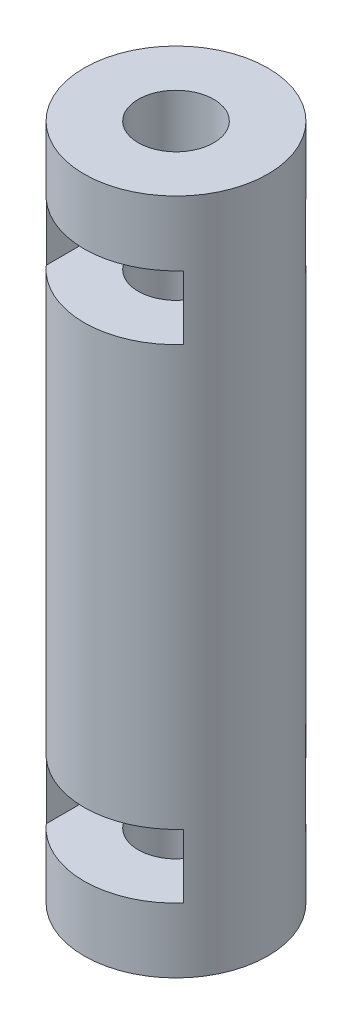
ISO-10303-21;
HEADER;
FILE_DESCRIPTION(('STEP AP214'),'2;1');
FILE_NAME('part.step','',(''),(''),'','','');
FILE_SCHEMA(('AUTOMOTIVE_DESIGN { 1 0 10303 214 1 1 1 1 }'));
ENDSEC;
DATA;
#1=APPLICATION_CONTEXT('core data for automotive mechanical design processes');
#2=APPLICATION_PROTOCOL_DEFINITION('international standard','automotive_design',2000,#1);
#3=PRODUCT_CONTEXT('',#1,'mechanical');
#4=PRODUCT('Part','Part','',(#3));
#5=PRODUCT_RELATED_PRODUCT_CATEGORY('part','',(#4));
#6=PRODUCT_DEFINITION_FORMATION('','',#4);
#7=PRODUCT_DEFINITION_CONTEXT('part definition',#1,'design');
#8=PRODUCT_DEFINITION('design','',#6,#7);
#9=PRODUCT_DEFINITION_SHAPE('','',#8);
#10=(LENGTH_UNIT() NAMED_UNIT(*) SI_UNIT(.MILLI.,.METRE.));
#11=(NAMED_UNIT(*) PLANE_ANGLE_UNIT() SI_UNIT($,.RADIAN.));
#12=(NAMED_UNIT(*) SI_UNIT($,.STERADIAN.) SOLID_ANGLE_UNIT());
#13=UNCERTAINTY_MEASURE_WITH_UNIT(LENGTH_MEASURE(1.E-05),#10,'distance_accuracy_value','');
#14=(GEOMETRIC_REPRESENTATION_CONTEXT(3) GLOBAL_UNCERTAINTY_ASSIGNED_CONTEXT((#13)) GLOBAL_UNIT_ASSIGNED_CONTEXT((#10,
#11,#12)) REPRESENTATION_CONTEXT('',''));
#15=CARTESIAN_POINT('',(0.,0.,0.));
#16=DIRECTION('',(0.,0.,1.));
#17=DIRECTION('',(1.,0.,0.));
#18=AXIS2_PLACEMENT_3D('',#15,#16,#17);
#19=CARTESIAN_POINT('',(0.,35.,0.));
#20=DIRECTION('',(0.,-1.,0.));
#21=DIRECTION('',(0.,0.,-1.));
#22=AXIS2_PLACEMENT_3D('',#19,#20,#21);
#23=CYLINDRICAL_SURFACE('',#22,1.95);
#24=CARTESIAN_POINT('',(0.,31.65,0.));
#25=DIRECTION('',(0.,1.,0.));
#26=DIRECTION('',(0.,0.,1.));
#27=AXIS2_PLACEMENT_3D('',#24,#25,#26);
#28=CIRCLE('',#27,1.95);
#29=CARTESIAN_POINT('',(0.,31.65,1.95));
#30=VERTEX_POINT('',#29);
#31=EDGE_CURVE('E143',#30,#30,#28,.T.);
#32=ORIENTED_EDGE('',*,*,#31,.F.);
#33=EDGE_LOOP('',(#32));
#34=FACE_BOUND('',#33,.T.);
#35=CARTESIAN_POINT('',(0.,35.,0.));
#36=DIRECTION('',(0.,1.,0.));
#37=DIRECTION('',(0.,0.,1.));
#38=AXIS2_PLACEMENT_3D('',#35,#36,#37);
#39=CIRCLE('',#38,1.95);
#40=CARTESIAN_POINT('',(0.,35.,1.95));
#41=VERTEX_POINT('',#40);
#42=EDGE_CURVE('E148',#41,#41,#39,.T.);
#43=ORIENTED_EDGE('',*,*,#42,.T.);
#44=EDGE_LOOP('',(#43));
#45=FACE_BOUND('',#44,.T.);
#46=ADVANCED_FACE('F39',(#34,#45),#23,.F.);
#47=CARTESIAN_POINT('',(0.,35.,0.));
#48=DIRECTION('',(0.,1.,0.));
#49=DIRECTION('',(0.,0.,1.));
#50=AXIS2_PLACEMENT_3D('',#47,#48,#49);
#51=PLANE('',#50);
#52=CARTESIAN_POINT('',(0.,35.,0.));
#53=DIRECTION('',(0.,1.,0.));
#54=DIRECTION('',(0.,0.,1.));
#55=AXIS2_PLACEMENT_3D('',#52,#53,#54);
#56=CIRCLE('',#55,4.75);
#57=CARTESIAN_POINT('',(0.,35.,4.75));
#58=VERTEX_POINT('',#57);
#59=EDGE_CURVE('E153',#58,#58,#56,.T.);
#60=ORIENTED_EDGE('',*,*,#59,.T.);
#61=EDGE_LOOP('',(#60));
#62=FACE_BOUND('',#61,.T.);
#63=ORIENTED_EDGE('',*,*,#42,.F.);
#64=EDGE_LOOP('',(#63));
#65=FACE_BOUND('',#64,.T.);
#66=ADVANCED_FACE('F209',(#62,#65),#51,.T.);
#67=CARTESIAN_POINT('',(0.,0.,0.));
#68=DIRECTION('',(0.,1.,0.));
#69=DIRECTION('',(0.,0.,1.));
#70=AXIS2_PLACEMENT_3D('',#67,#68,#69);
#71=PLANE('',#70);
#72=CARTESIAN_POINT('',(0.,0.,0.));
#73=DIRECTION('',(0.,1.,0.));
#74=DIRECTION('',(0.,0.,1.));
#75=AXIS2_PLACEMENT_3D('',#72,#73,#74);
#76=CIRCLE('',#75,4.75);
#77=CARTESIAN_POINT('',(0.,0.,4.75));
#78=VERTEX_POINT('',#77);
#79=EDGE_CURVE('E149',#78,#78,#76,.T.);
#80=ORIENTED_EDGE('',*,*,#79,.F.);
#81=EDGE_LOOP('',(#80));
#82=FACE_BOUND('',#81,.T.);
#83=CARTESIAN_POINT('',(0.,0.,0.));
#84=DIRECTION('',(0.,1.,0.));
#85=DIRECTION('',(0.,0.,1.));
#86=AXIS2_PLACEMENT_3D('',#83,#84,#85);
#87=CIRCLE('',#86,1.95);
#88=CARTESIAN_POINT('',(0.,0.,1.95));
#89=VERTEX_POINT('',#88);
#90=EDGE_CURVE('E147',#89,#89,#87,.T.);
#91=ORIENTED_EDGE('',*,*,#90,.T.);
#92=EDGE_LOOP('',(#91));
#93=FACE_BOUND('',#92,.T.);
#94=ADVANCED_FACE('F201',(#82,#93),#71,.F.);
#95=CARTESIAN_POINT('',(0.,35.,0.));
#96=DIRECTION('',(0.,-1.,0.));
#97=DIRECTION('',(0.,0.,-1.));
#98=AXIS2_PLACEMENT_3D('',#95,#96,#97);
#99=CYLINDRICAL_SURFACE('',#98,4.75);
#100=DIRECTION('',(0.,-1.,0.));
#101=VECTOR('',#100,1.);
#102=CARTESIAN_POINT('',(3.55,35.,-3.1559467676119));
#103=LINE('',#102,#101);
#104=CARTESIAN_POINT('',(3.55,28.35,-3.1559467676119));
#105=VERTEX_POINT('',#104);
#106=CARTESIAN_POINT('',(3.55,31.65,-3.1559467676119));
#107=VERTEX_POINT('',#106);
#108=EDGE_CURVE('E11',#105,#107,#103,.F.);
#109=ORIENTED_EDGE('',*,*,#108,.T.);
#110=CARTESIAN_POINT('',(0.,31.65,0.));
#111=DIRECTION('',(0.,1.,0.));
#112=DIRECTION('',(0.,0.,1.));
#113=AXIS2_PLACEMENT_3D('',#110,#111,#112);
#114=CIRCLE('',#113,4.75);
#115=CARTESIAN_POINT('',(-3.55,31.65,-3.1559467676119));
#116=VERTEX_POINT('',#115);
#117=EDGE_CURVE('E52',#107,#116,#114,.T.);
#118=ORIENTED_EDGE('',*,*,#117,.T.);
#119=DIRECTION('',(0.,-1.,0.));
#120=VECTOR('',#119,1.);
#121=CARTESIAN_POINT('',(-3.55,35.,-3.1559467676119));
#122=LINE('',#121,#120);
#123=CARTESIAN_POINT('',(-3.55,28.35,-3.1559467676119));
#124=VERTEX_POINT('',#123);
#125=EDGE_CURVE('E50',#116,#124,#122,.T.);
#126=ORIENTED_EDGE('',*,*,#125,.T.);
#127=CARTESIAN_POINT('',(0.,28.35,0.));
#128=DIRECTION('',(0.,-1.,0.));
#129=DIRECTION('',(0.,0.,-1.));
#130=AXIS2_PLACEMENT_3D('',#127,#128,#129);
#131=CIRCLE('',#130,4.75);
#132=EDGE_CURVE('E142',#124,#105,#131,.T.);
#133=ORIENTED_EDGE('',*,*,#132,.T.);
#134=EDGE_LOOP('',(#109,#118,#126,#133));
#135=FACE_BOUND('',#134,.T.);
#136=CARTESIAN_POINT('',(-3.55,31.65,3.1559467676119));
#137=VERTEX_POINT('',#136);
#138=CARTESIAN_POINT('',(3.55,31.65,3.1559467676119));
#139=VERTEX_POINT('',#138);
#140=EDGE_CURVE('E136',#137,#139,#114,.T.);
#141=ORIENTED_EDGE('',*,*,#140,.T.);
#142=DIRECTION('',(0.,-1.,0.));
#143=VECTOR('',#142,1.);
#144=CARTESIAN_POINT('',(3.55,35.,3.1559467676119));
#145=LINE('',#144,#143);
#146=CARTESIAN_POINT('',(3.55,28.35,3.1559467676119));
#147=VERTEX_POINT('',#146);
#148=EDGE_CURVE('E174',#139,#147,#145,.T.);
#149=ORIENTED_EDGE('',*,*,#148,.T.);
#150=CARTESIAN_POINT('',(-3.55,28.35,3.1559467676119));
#151=VERTEX_POINT('',#150);
#152=EDGE_CURVE('E145',#147,#151,#131,.T.);
#153=ORIENTED_EDGE('',*,*,#152,.T.);
#154=DIRECTION('',(0.,-1.,0.));
#155=VECTOR('',#154,1.);
#156=CARTESIAN_POINT('',(-3.55,35.,3.1559467676119));
#157=LINE('',#156,#155);
#158=EDGE_CURVE('E123',#151,#137,#157,.F.);
#159=ORIENTED_EDGE('',*,*,#158,.T.);
#160=EDGE_LOOP('',(#141,#149,#153,#159));
#161=FACE_BOUND('',#160,.T.);
#162=DIRECTION('',(0.,-1.,0.));
#163=VECTOR('',#162,1.);
#164=CARTESIAN_POINT('',(3.54999999999999,35.,-3.15594676761191));
#165=LINE('',#164,#163);
#166=CARTESIAN_POINT('',(3.54999999999999,3.35,-3.15594676761191));
#167=VERTEX_POINT('',#166);
#168=CARTESIAN_POINT('',(3.54999999999999,6.65,-3.15594676761191));
#169=VERTEX_POINT('',#168);
#170=EDGE_CURVE('E108',#167,#169,#165,.F.);
#171=ORIENTED_EDGE('',*,*,#170,.T.);
#172=CARTESIAN_POINT('',(0.,6.65,0.));
#173=DIRECTION('',(0.,1.,0.));
#174=DIRECTION('',(0.,0.,1.));
#175=AXIS2_PLACEMENT_3D('',#172,#173,#174);
#176=CIRCLE('',#175,4.75);
#177=CARTESIAN_POINT('',(-3.55000000000001,6.65,-3.15594676761189));
#178=VERTEX_POINT('',#177);
#179=EDGE_CURVE('E140',#169,#178,#176,.T.);
#180=ORIENTED_EDGE('',*,*,#179,.T.);
#181=DIRECTION('',(0.,-1.,0.));
#182=VECTOR('',#181,1.);
#183=CARTESIAN_POINT('',(-3.55000000000001,35.,-3.15594676761189));
#184=LINE('',#183,#182);
#185=CARTESIAN_POINT('',(-3.55000000000001,3.35,-3.15594676761189));
#186=VERTEX_POINT('',#185);
#187=EDGE_CURVE('E109',#178,#186,#184,.T.);
#188=ORIENTED_EDGE('',*,*,#187,.T.);
#189=CARTESIAN_POINT('',(0.,3.35,0.));
#190=DIRECTION('',(0.,-1.,0.));
#191=DIRECTION('',(0.,0.,-1.));
#192=AXIS2_PLACEMENT_3D('',#189,#190,#191);
#193=CIRCLE('',#192,4.75);
#194=EDGE_CURVE('E106',#186,#167,#193,.T.);
#195=ORIENTED_EDGE('',*,*,#194,.T.);
#196=EDGE_LOOP('',(#171,#180,#188,#195));
#197=FACE_BOUND('',#196,.T.);
#198=CARTESIAN_POINT('',(-3.55000000000001,6.65,3.15594676761189));
#199=VERTEX_POINT('',#198);
#200=CARTESIAN_POINT('',(3.54999999999999,6.65,3.15594676761191));
#201=VERTEX_POINT('',#200);
#202=EDGE_CURVE('E132',#199,#201,#176,.T.);
#203=ORIENTED_EDGE('',*,*,#202,.T.);
#204=DIRECTION('',(0.,-1.,0.));
#205=VECTOR('',#204,1.);
#206=CARTESIAN_POINT('',(3.54999999999999,35.,3.15594676761191));
#207=LINE('',#206,#205);
#208=CARTESIAN_POINT('',(3.54999999999999,3.35,3.15594676761191));
#209=VERTEX_POINT('',#208);
#210=EDGE_CURVE('E127',#201,#209,#207,.T.);
#211=ORIENTED_EDGE('',*,*,#210,.T.);
#212=CARTESIAN_POINT('',(-3.55000000000001,3.35,3.15594676761189));
#213=VERTEX_POINT('',#212);
#214=EDGE_CURVE('E114',#209,#213,#193,.T.);
#215=ORIENTED_EDGE('',*,*,#214,.T.);
#216=DIRECTION('',(0.,-1.,0.));
#217=VECTOR('',#216,1.);
#218=CARTESIAN_POINT('',(-3.55000000000001,35.,3.15594676761189));
#219=LINE('',#218,#217);
#220=EDGE_CURVE('E156',#213,#199,#219,.F.);
#221=ORIENTED_EDGE('',*,*,#220,.T.);
#222=EDGE_LOOP('',(#203,#211,#215,#221));
#223=FACE_BOUND('',#222,.T.);
#224=ORIENTED_EDGE('',*,*,#59,.F.);
#225=EDGE_LOOP('',(#224));
#226=FACE_BOUND('',#225,.T.);
#227=ORIENTED_EDGE('',*,*,#79,.T.);
#228=EDGE_LOOP('',(#227));
#229=FACE_BOUND('',#228,.T.);
#230=ADVANCED_FACE('F41',(#135,#161,#197,#223,#226,#229),#99,.T.);
#231=CARTESIAN_POINT('',(0.,3.35,0.));
#232=DIRECTION('',(0.,-1.,0.));
#233=DIRECTION('',(0.,0.,-1.));
#234=AXIS2_PLACEMENT_3D('',#231,#232,#233);
#235=CIRCLE('',#234,1.95);
#236=CARTESIAN_POINT('',(0.,3.35,-1.95));
#237=VERTEX_POINT('',#236);
#238=EDGE_CURVE('E111',#237,#237,#235,.T.);
#239=ORIENTED_EDGE('',*,*,#238,.F.);
#240=EDGE_LOOP('',(#239));
#241=FACE_BOUND('',#240,.T.);
#242=ORIENTED_EDGE('',*,*,#90,.F.);
#243=EDGE_LOOP('',(#242));
#244=FACE_BOUND('',#243,.T.);
#245=ADVANCED_FACE('F205',(#241,#244),#23,.F.);
#246=CARTESIAN_POINT('',(3.54999999999999,6.65,-4.75));
#247=DIRECTION('',(1.,0.,0.));
#248=DIRECTION('',(0.,0.,-1.));
#249=AXIS2_PLACEMENT_3D('',#246,#247,#248);
#250=PLANE('',#249);
#251=DIRECTION('',(0.,0.,1.));
#252=VECTOR('',#251,1.);
#253=CARTESIAN_POINT('',(3.54999999999999,6.65,-4.75));
#254=LINE('',#253,#252);
#255=EDGE_CURVE('E121',#169,#201,#254,.T.);
#256=ORIENTED_EDGE('',*,*,#255,.F.);
#257=ORIENTED_EDGE('',*,*,#170,.F.);
#258=DIRECTION('',(0.,0.,1.));
#259=VECTOR('',#258,1.);
#260=CARTESIAN_POINT('',(3.54999999999999,3.35,-4.75));
#261=LINE('',#260,#259);
#262=EDGE_CURVE('E122',#167,#209,#261,.T.);
#263=ORIENTED_EDGE('',*,*,#262,.T.);
#264=ORIENTED_EDGE('',*,*,#210,.F.);
#265=EDGE_LOOP('',(#256,#257,#263,#264));
#266=FACE_BOUND('',#265,.T.);
#267=ADVANCED_FACE('F119',(#266),#250,.F.);
#268=CARTESIAN_POINT('',(-3.55000000000001,6.65,-4.75));
#269=DIRECTION('',(-1.,0.,0.));
#270=DIRECTION('',(0.,0.,1.));
#271=AXIS2_PLACEMENT_3D('',#268,#269,#270);
#272=PLANE('',#271);
#273=DIRECTION('',(0.,0.,1.));
#274=VECTOR('',#273,1.);
#275=CARTESIAN_POINT('',(-3.55000000000001,6.65,-4.75));
#276=LINE('',#275,#274);
#277=EDGE_CURVE('E128',#178,#199,#276,.T.);
#278=ORIENTED_EDGE('',*,*,#277,.T.);
#279=ORIENTED_EDGE('',*,*,#220,.F.);
#280=DIRECTION('',(0.,0.,1.));
#281=VECTOR('',#280,1.);
#282=CARTESIAN_POINT('',(-3.55000000000001,3.35,-4.75));
#283=LINE('',#282,#281);
#284=EDGE_CURVE('E63',#186,#213,#283,.T.);
#285=ORIENTED_EDGE('',*,*,#284,.F.);
#286=ORIENTED_EDGE('',*,*,#187,.F.);
#287=EDGE_LOOP('',(#278,#279,#285,#286));
#288=FACE_BOUND('',#287,.T.);
#289=ADVANCED_FACE('F197',(#288),#272,.F.);
#290=CARTESIAN_POINT('',(-3.55000000000001,6.65,-4.75));
#291=DIRECTION('',(0.,1.,0.));
#292=DIRECTION('',(0.,0.,1.));
#293=AXIS2_PLACEMENT_3D('',#290,#291,#292);
#294=PLANE('',#293);
#295=CARTESIAN_POINT('',(0.,6.65,0.));
#296=DIRECTION('',(0.,1.,0.));
#297=DIRECTION('',(0.,0.,1.));
#298=AXIS2_PLACEMENT_3D('',#295,#296,#297);
#299=CIRCLE('',#298,1.95);
#300=CARTESIAN_POINT('',(0.,6.65,1.95));
#301=VERTEX_POINT('',#300);
#302=EDGE_CURVE('E139',#301,#301,#299,.T.);
#303=ORIENTED_EDGE('',*,*,#302,.T.);
#304=EDGE_LOOP('',(#303));
#305=FACE_BOUND('',#304,.T.);
#306=ORIENTED_EDGE('',*,*,#255,.T.);
#307=ORIENTED_EDGE('',*,*,#202,.F.);
#308=ORIENTED_EDGE('',*,*,#277,.F.);
#309=ORIENTED_EDGE('',*,*,#179,.F.);
#310=EDGE_LOOP('',(#306,#307,#308,#309));
#311=FACE_BOUND('',#310,.T.);
#312=ADVANCED_FACE('F200',(#305,#311),#294,.F.);
#313=CARTESIAN_POINT('',(-3.55000000000001,3.35,-4.75));
#314=DIRECTION('',(0.,-1.,0.));
#315=DIRECTION('',(0.,0.,-1.));
#316=AXIS2_PLACEMENT_3D('',#313,#314,#315);
#317=PLANE('',#316);
#318=ORIENTED_EDGE('',*,*,#238,.T.);
#319=EDGE_LOOP('',(#318));
#320=FACE_BOUND('',#319,.T.);
#321=ORIENTED_EDGE('',*,*,#262,.F.);
#322=ORIENTED_EDGE('',*,*,#194,.F.);
#323=ORIENTED_EDGE('',*,*,#284,.T.);
#324=ORIENTED_EDGE('',*,*,#214,.F.);
#325=EDGE_LOOP('',(#321,#322,#323,#324));
#326=FACE_BOUND('',#325,.T.);
#327=ADVANCED_FACE('F126',(#320,#326),#317,.F.);
#328=CARTESIAN_POINT('',(0.,28.35,0.));
#329=DIRECTION('',(0.,-1.,0.));
#330=DIRECTION('',(0.,0.,-1.));
#331=AXIS2_PLACEMENT_3D('',#328,#329,#330);
#332=CIRCLE('',#331,1.95);
#333=CARTESIAN_POINT('',(0.,28.35,-1.95));
#334=VERTEX_POINT('',#333);
#335=EDGE_CURVE('E144',#334,#334,#332,.T.);
#336=ORIENTED_EDGE('',*,*,#335,.F.);
#337=EDGE_LOOP('',(#336));
#338=FACE_BOUND('',#337,.T.);
#339=ORIENTED_EDGE('',*,*,#302,.F.);
#340=EDGE_LOOP('',(#339));
#341=FACE_BOUND('',#340,.T.);
#342=ADVANCED_FACE('F216',(#338,#341),#23,.F.);
#343=CARTESIAN_POINT('',(3.55,28.35,-4.75));
#344=DIRECTION('',(1.,0.,0.));
#345=DIRECTION('',(0.,0.,-1.));
#346=AXIS2_PLACEMENT_3D('',#343,#344,#345);
#347=PLANE('',#346);
#348=DIRECTION('',(0.,0.,1.));
#349=VECTOR('',#348,1.);
#350=CARTESIAN_POINT('',(3.55,31.65,-4.75));
#351=LINE('',#350,#349);
#352=EDGE_CURVE('E192',#107,#139,#351,.T.);
#353=ORIENTED_EDGE('',*,*,#352,.F.);
#354=ORIENTED_EDGE('',*,*,#108,.F.);
#355=DIRECTION('',(0.,0.,1.));
#356=VECTOR('',#355,1.);
#357=CARTESIAN_POINT('',(3.55,28.35,-4.75));
#358=LINE('',#357,#356);
#359=EDGE_CURVE('E161',#105,#147,#358,.T.);
#360=ORIENTED_EDGE('',*,*,#359,.T.);
#361=ORIENTED_EDGE('',*,*,#148,.F.);
#362=EDGE_LOOP('',(#353,#354,#360,#361));
#363=FACE_BOUND('',#362,.T.);
#364=ADVANCED_FACE('F221',(#363),#347,.F.);
#365=CARTESIAN_POINT('',(-3.55,28.35,-4.75));
#366=DIRECTION('',(-1.,0.,0.));
#367=DIRECTION('',(0.,0.,1.));
#368=AXIS2_PLACEMENT_3D('',#365,#366,#367);
#369=PLANE('',#368);
#370=DIRECTION('',(0.,0.,1.));
#371=VECTOR('',#370,1.);
#372=CARTESIAN_POINT('',(-3.55,31.65,-4.75));
#373=LINE('',#372,#371);
#374=EDGE_CURVE('E184',#116,#137,#373,.T.);
#375=ORIENTED_EDGE('',*,*,#374,.T.);
#376=ORIENTED_EDGE('',*,*,#158,.F.);
#377=DIRECTION('',(0.,0.,1.));
#378=VECTOR('',#377,1.);
#379=CARTESIAN_POINT('',(-3.55,28.35,-4.75));
#380=LINE('',#379,#378);
#381=EDGE_CURVE('E188',#124,#151,#380,.T.);
#382=ORIENTED_EDGE('',*,*,#381,.F.);
#383=ORIENTED_EDGE('',*,*,#125,.F.);
#384=EDGE_LOOP('',(#375,#376,#382,#383));
#385=FACE_BOUND('',#384,.T.);
#386=ADVANCED_FACE('F185',(#385),#369,.F.);
#387=CARTESIAN_POINT('',(-3.55,28.35,-4.75));
#388=DIRECTION('',(0.,-1.,0.));
#389=DIRECTION('',(0.,0.,-1.));
#390=AXIS2_PLACEMENT_3D('',#387,#388,#389);
#391=PLANE('',#390);
#392=ORIENTED_EDGE('',*,*,#335,.T.);
#393=EDGE_LOOP('',(#392));
#394=FACE_BOUND('',#393,.T.);
#395=ORIENTED_EDGE('',*,*,#359,.F.);
#396=ORIENTED_EDGE('',*,*,#132,.F.);
#397=ORIENTED_EDGE('',*,*,#381,.T.);
#398=ORIENTED_EDGE('',*,*,#152,.F.);
#399=EDGE_LOOP('',(#395,#396,#397,#398));
#400=FACE_BOUND('',#399,.T.);
#401=ADVANCED_FACE('F238',(#394,#400),#391,.F.);
#402=CARTESIAN_POINT('',(-3.55,31.65,-4.75));
#403=DIRECTION('',(0.,1.,0.));
#404=DIRECTION('',(0.,0.,1.));
#405=AXIS2_PLACEMENT_3D('',#402,#403,#404);
#406=PLANE('',#405);
#407=ORIENTED_EDGE('',*,*,#31,.T.);
#408=EDGE_LOOP('',(#407));
#409=FACE_BOUND('',#408,.T.);
#410=ORIENTED_EDGE('',*,*,#352,.T.);
#411=ORIENTED_EDGE('',*,*,#140,.F.);
#412=ORIENTED_EDGE('',*,*,#374,.F.);
#413=ORIENTED_EDGE('',*,*,#117,.F.);
#414=EDGE_LOOP('',(#410,#411,#412,#413));
#415=FACE_BOUND('',#414,.T.);
#416=ADVANCED_FACE('F240',(#409,#415),#406,.F.);
#417=CLOSED_SHELL('',(#46,#66,#94,#230,#245,#267,#289,#312,#327,#342,#364,#386,#401,#416));
#418=MANIFOLD_SOLID_BREP('B2',#417);
#419=ADVANCED_BREP_SHAPE_REPRESENTATION('',(#18,#418),#14);
#420=SHAPE_DEFINITION_REPRESENTATION(#9,#419);
ENDSEC;
END-ISO-10303-21;
